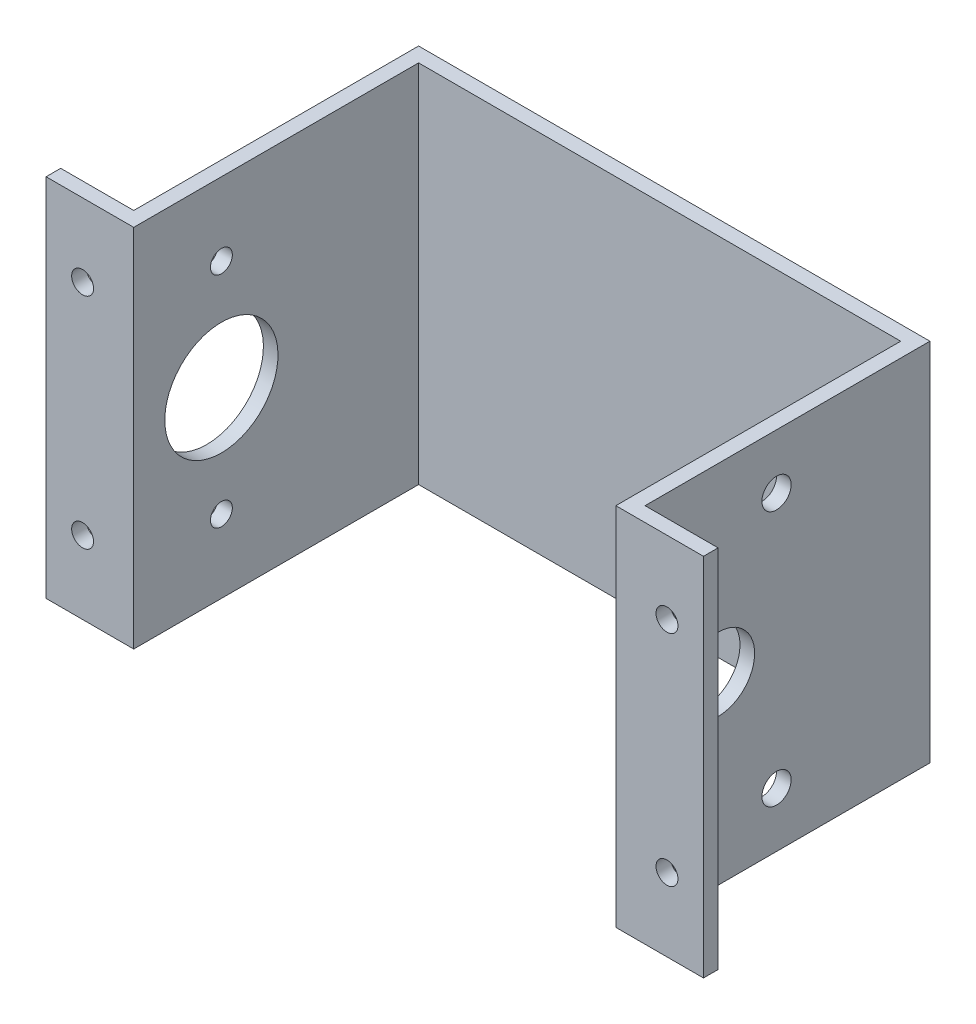
ISO-10303-21;
HEADER;
FILE_DESCRIPTION(('STEP AP214'),'2;1');
FILE_NAME('part.step','',(''),(''),'','','');
FILE_SCHEMA(('AUTOMOTIVE_DESIGN { 1 0 10303 214 1 1 1 1 }'));
ENDSEC;
DATA;
#1=APPLICATION_CONTEXT('core data for automotive mechanical design processes');
#2=APPLICATION_PROTOCOL_DEFINITION('international standard','automotive_design',2000,#1);
#3=PRODUCT_CONTEXT('',#1,'mechanical');
#4=PRODUCT('Part','Part','',(#3));
#5=PRODUCT_RELATED_PRODUCT_CATEGORY('part','',(#4));
#6=PRODUCT_DEFINITION_FORMATION('','',#4);
#7=PRODUCT_DEFINITION_CONTEXT('part definition',#1,'design');
#8=PRODUCT_DEFINITION('design','',#6,#7);
#9=PRODUCT_DEFINITION_SHAPE('','',#8);
#10=(LENGTH_UNIT() NAMED_UNIT(*) SI_UNIT(.MILLI.,.METRE.));
#11=(NAMED_UNIT(*) PLANE_ANGLE_UNIT() SI_UNIT($,.RADIAN.));
#12=(NAMED_UNIT(*) SI_UNIT($,.STERADIAN.) SOLID_ANGLE_UNIT());
#13=UNCERTAINTY_MEASURE_WITH_UNIT(LENGTH_MEASURE(1.E-05),#10,'distance_accuracy_value','');
#14=(GEOMETRIC_REPRESENTATION_CONTEXT(3) GLOBAL_UNCERTAINTY_ASSIGNED_CONTEXT((#13)) GLOBAL_UNIT_ASSIGNED_CONTEXT((#10,
#11,#12)) REPRESENTATION_CONTEXT('',''));
#15=CARTESIAN_POINT('',(0.,0.,0.));
#16=DIRECTION('',(0.,0.,1.));
#17=DIRECTION('',(1.,0.,0.));
#18=AXIS2_PLACEMENT_3D('',#15,#16,#17);
#19=CARTESIAN_POINT('',(0.,0.,2.));
#20=DIRECTION('',(0.,0.,-1.));
#21=DIRECTION('',(-1.,0.,0.));
#22=AXIS2_PLACEMENT_3D('',#19,#20,#21);
#23=PLANE('',#22);
#24=DIRECTION('',(0.,-1.,0.));
#25=VECTOR('',#24,1.);
#26=CARTESIAN_POINT('',(33.,25.,2.));
#27=LINE('',#26,#25);
#28=CARTESIAN_POINT('',(33.,25.,2.));
#29=VERTEX_POINT('',#28);
#30=CARTESIAN_POINT('',(33.,-25.,2.));
#31=VERTEX_POINT('',#30);
#32=EDGE_CURVE('E54',#29,#31,#27,.T.);
#33=ORIENTED_EDGE('',*,*,#32,.F.);
#34=DIRECTION('',(-1.,0.,0.));
#35=VECTOR('',#34,1.);
#36=CARTESIAN_POINT('',(35.,25.,2.));
#37=LINE('',#36,#35);
#38=CARTESIAN_POINT('',(-33.,25.,2.));
#39=VERTEX_POINT('',#38);
#40=EDGE_CURVE('E209',#29,#39,#37,.T.);
#41=ORIENTED_EDGE('',*,*,#40,.T.);
#42=DIRECTION('',(0.,1.,0.));
#43=VECTOR('',#42,1.);
#44=CARTESIAN_POINT('',(-33.,25.,2.));
#45=LINE('',#44,#43);
#46=CARTESIAN_POINT('',(-33.,-25.,2.));
#47=VERTEX_POINT('',#46);
#48=EDGE_CURVE('E59',#47,#39,#45,.T.);
#49=ORIENTED_EDGE('',*,*,#48,.F.);
#50=DIRECTION('',(1.,0.,0.));
#51=VECTOR('',#50,1.);
#52=CARTESIAN_POINT('',(35.,-25.,2.));
#53=LINE('',#52,#51);
#54=EDGE_CURVE('E207',#47,#31,#53,.T.);
#55=ORIENTED_EDGE('',*,*,#54,.T.);
#56=EDGE_LOOP('',(#33,#41,#49,#55));
#57=FACE_BOUND('',#56,.T.);
#58=ADVANCED_FACE('F39',(#57),#23,.F.);
#59=CARTESIAN_POINT('',(-35.,25.,2.));
#60=DIRECTION('',(1.,0.,0.));
#61=DIRECTION('',(0.,1.,0.));
#62=AXIS2_PLACEMENT_3D('',#59,#60,#61);
#63=PLANE('',#62);
#64=CARTESIAN_POINT('',(-35.,-15.,29.));
#65=DIRECTION('',(-1.,0.,0.));
#66=DIRECTION('',(0.,-1.,0.));
#67=AXIS2_PLACEMENT_3D('',#64,#65,#66);
#68=CIRCLE('',#67,1.5);
#69=CARTESIAN_POINT('',(-35.,-16.5,29.));
#70=VERTEX_POINT('',#69);
#71=EDGE_CURVE('E548',#70,#70,#68,.T.);
#72=ORIENTED_EDGE('',*,*,#71,.F.);
#73=EDGE_LOOP('',(#72));
#74=FACE_BOUND('',#73,.T.);
#75=CARTESIAN_POINT('',(-35.,15.,29.));
#76=DIRECTION('',(-1.,0.,0.));
#77=DIRECTION('',(0.,-1.,0.));
#78=AXIS2_PLACEMENT_3D('',#75,#76,#77);
#79=CIRCLE('',#78,1.5);
#80=CARTESIAN_POINT('',(-35.,13.5,29.));
#81=VERTEX_POINT('',#80);
#82=EDGE_CURVE('E541',#81,#81,#79,.T.);
#83=ORIENTED_EDGE('',*,*,#82,.F.);
#84=EDGE_LOOP('',(#83));
#85=FACE_BOUND('',#84,.T.);
#86=CARTESIAN_POINT('',(-35.,0.,29.));
#87=DIRECTION('',(-1.,0.,0.));
#88=DIRECTION('',(0.,-1.,0.));
#89=AXIS2_PLACEMENT_3D('',#86,#87,#88);
#90=CIRCLE('',#89,7.74999999999999);
#91=CARTESIAN_POINT('',(-35.,-7.75,29.));
#92=VERTEX_POINT('',#91);
#93=EDGE_CURVE('E544',#92,#92,#90,.T.);
#94=ORIENTED_EDGE('',*,*,#93,.F.);
#95=EDGE_LOOP('',(#94));
#96=FACE_BOUND('',#95,.T.);
#97=DIRECTION('',(0.,-1.,0.));
#98=VECTOR('',#97,1.);
#99=CARTESIAN_POINT('',(-35.,25.,0.));
#100=LINE('',#99,#98);
#101=CARTESIAN_POINT('',(-35.,25.,0.));
#102=VERTEX_POINT('',#101);
#103=CARTESIAN_POINT('',(-35.,-25.,0.));
#104=VERTEX_POINT('',#103);
#105=EDGE_CURVE('E197',#102,#104,#100,.T.);
#106=ORIENTED_EDGE('',*,*,#105,.T.);
#107=DIRECTION('',(0.,0.,-1.));
#108=VECTOR('',#107,1.);
#109=CARTESIAN_POINT('',(-35.,-25.,2.));
#110=LINE('',#109,#108);
#111=CARTESIAN_POINT('',(-35.,-25.,39.));
#112=VERTEX_POINT('',#111);
#113=EDGE_CURVE('E11',#112,#104,#110,.T.);
#114=ORIENTED_EDGE('',*,*,#113,.F.);
#115=DIRECTION('',(0.,-1.,0.));
#116=VECTOR('',#115,1.);
#117=CARTESIAN_POINT('',(-35.,25.,39.));
#118=LINE('',#117,#116);
#119=CARTESIAN_POINT('',(-35.,25.,39.));
#120=VERTEX_POINT('',#119);
#121=EDGE_CURVE('E203',#120,#112,#118,.T.);
#122=ORIENTED_EDGE('',*,*,#121,.F.);
#123=DIRECTION('',(0.,0.,-1.));
#124=VECTOR('',#123,1.);
#125=CARTESIAN_POINT('',(-35.,25.,2.));
#126=LINE('',#125,#124);
#127=EDGE_CURVE('E212',#120,#102,#126,.T.);
#128=ORIENTED_EDGE('',*,*,#127,.T.);
#129=EDGE_LOOP('',(#106,#114,#122,#128));
#130=FACE_BOUND('',#129,.T.);
#131=ADVANCED_FACE('F41',(#74,#85,#96,#130),#63,.F.);
#132=CARTESIAN_POINT('',(35.,-25.,2.));
#133=DIRECTION('',(0.,1.,0.));
#134=DIRECTION('',(-1.,0.,0.));
#135=AXIS2_PLACEMENT_3D('',#132,#133,#134);
#136=PLANE('',#135);
#137=DIRECTION('',(1.,0.,0.));
#138=VECTOR('',#137,1.);
#139=CARTESIAN_POINT('',(35.,-25.,0.));
#140=LINE('',#139,#138);
#141=CARTESIAN_POINT('',(35.,-25.,0.));
#142=VERTEX_POINT('',#141);
#143=EDGE_CURVE('E215',#104,#142,#140,.T.);
#144=ORIENTED_EDGE('',*,*,#143,.T.);
#145=DIRECTION('',(0.,0.,-1.));
#146=VECTOR('',#145,1.);
#147=CARTESIAN_POINT('',(35.,-25.,2.));
#148=LINE('',#147,#146);
#149=CARTESIAN_POINT('',(35.,-25.,39.));
#150=VERTEX_POINT('',#149);
#151=EDGE_CURVE('E47',#150,#142,#148,.T.);
#152=ORIENTED_EDGE('',*,*,#151,.F.);
#153=DIRECTION('',(1.,0.,0.));
#154=VECTOR('',#153,1.);
#155=CARTESIAN_POINT('',(33.,-25.,39.));
#156=LINE('',#155,#154);
#157=CARTESIAN_POINT('',(45.,-25.,39.));
#158=VERTEX_POINT('',#157);
#159=EDGE_CURVE('E162',#150,#158,#156,.T.);
#160=ORIENTED_EDGE('',*,*,#159,.T.);
#161=DIRECTION('',(0.,0.,-1.));
#162=VECTOR('',#161,1.);
#163=CARTESIAN_POINT('',(45.,-25.,41.));
#164=LINE('',#163,#162);
#165=CARTESIAN_POINT('',(45.,-25.,41.));
#166=VERTEX_POINT('',#165);
#167=EDGE_CURVE('E141',#166,#158,#164,.T.);
#168=ORIENTED_EDGE('',*,*,#167,.F.);
#169=DIRECTION('',(1.,0.,0.));
#170=VECTOR('',#169,1.);
#171=CARTESIAN_POINT('',(33.,-25.,41.));
#172=LINE('',#171,#170);
#173=CARTESIAN_POINT('',(33.,-25.,41.));
#174=VERTEX_POINT('',#173);
#175=EDGE_CURVE('E138',#174,#166,#172,.T.);
#176=ORIENTED_EDGE('',*,*,#175,.F.);
#177=DIRECTION('',(0.,0.,-1.));
#178=VECTOR('',#177,1.);
#179=CARTESIAN_POINT('',(33.,-25.,39.));
#180=LINE('',#179,#178);
#181=EDGE_CURVE('E127',#174,#31,#180,.T.);
#182=ORIENTED_EDGE('',*,*,#181,.T.);
#183=ORIENTED_EDGE('',*,*,#54,.F.);
#184=DIRECTION('',(0.,0.,-1.));
#185=VECTOR('',#184,1.);
#186=CARTESIAN_POINT('',(-33.,-25.,39.));
#187=LINE('',#186,#185);
#188=CARTESIAN_POINT('',(-33.,-25.,41.));
#189=VERTEX_POINT('',#188);
#190=EDGE_CURVE('E169',#189,#47,#187,.T.);
#191=ORIENTED_EDGE('',*,*,#190,.F.);
#192=DIRECTION('',(1.,0.,0.));
#193=VECTOR('',#192,1.);
#194=CARTESIAN_POINT('',(-33.,-25.,41.));
#195=LINE('',#194,#193);
#196=CARTESIAN_POINT('',(-45.,-25.,41.));
#197=VERTEX_POINT('',#196);
#198=EDGE_CURVE('E177',#197,#189,#195,.T.);
#199=ORIENTED_EDGE('',*,*,#198,.F.);
#200=DIRECTION('',(0.,0.,-1.));
#201=VECTOR('',#200,1.);
#202=CARTESIAN_POINT('',(-45.,-25.,41.));
#203=LINE('',#202,#201);
#204=CARTESIAN_POINT('',(-45.,-25.,39.));
#205=VERTEX_POINT('',#204);
#206=EDGE_CURVE('E173',#197,#205,#203,.T.);
#207=ORIENTED_EDGE('',*,*,#206,.T.);
#208=DIRECTION('',(1.,0.,0.));
#209=VECTOR('',#208,1.);
#210=CARTESIAN_POINT('',(-33.,-25.,39.));
#211=LINE('',#210,#209);
#212=EDGE_CURVE('E178',#205,#112,#211,.T.);
#213=ORIENTED_EDGE('',*,*,#212,.T.);
#214=ORIENTED_EDGE('',*,*,#113,.T.);
#215=EDGE_LOOP('',(#144,#152,#160,#168,#176,#182,#183,#191,#199,#207,#213,#214));
#216=FACE_BOUND('',#215,.T.);
#217=ADVANCED_FACE('F139',(#216),#136,.F.);
#218=CARTESIAN_POINT('',(35.,25.,2.));
#219=DIRECTION('',(-1.,0.,0.));
#220=DIRECTION('',(0.,-1.,0.));
#221=AXIS2_PLACEMENT_3D('',#218,#219,#220);
#222=PLANE('',#221);
#223=CARTESIAN_POINT('',(35.,0.,29.));
#224=DIRECTION('',(1.,0.,0.));
#225=DIRECTION('',(0.,1.,0.));
#226=AXIS2_PLACEMENT_3D('',#223,#224,#225);
#227=CIRCLE('',#226,5.);
#228=CARTESIAN_POINT('',(35.,5.,29.));
#229=VERTEX_POINT('',#228);
#230=EDGE_CURVE('E560',#229,#229,#227,.T.);
#231=ORIENTED_EDGE('',*,*,#230,.F.);
#232=EDGE_LOOP('',(#231));
#233=FACE_BOUND('',#232,.T.);
#234=CARTESIAN_POINT('',(35.,17.5,21.));
#235=DIRECTION('',(1.,0.,0.));
#236=DIRECTION('',(0.,1.,0.));
#237=AXIS2_PLACEMENT_3D('',#234,#235,#236);
#238=CIRCLE('',#237,2.00000000000001);
#239=CARTESIAN_POINT('',(35.,19.5,21.));
#240=VERTEX_POINT('',#239);
#241=EDGE_CURVE('E563',#240,#240,#238,.T.);
#242=ORIENTED_EDGE('',*,*,#241,.F.);
#243=EDGE_LOOP('',(#242));
#244=FACE_BOUND('',#243,.T.);
#245=CARTESIAN_POINT('',(35.,-17.5,21.));
#246=DIRECTION('',(1.,0.,0.));
#247=DIRECTION('',(0.,1.,0.));
#248=AXIS2_PLACEMENT_3D('',#245,#246,#247);
#249=CIRCLE('',#248,2.00000000000001);
#250=CARTESIAN_POINT('',(35.,-15.5,21.));
#251=VERTEX_POINT('',#250);
#252=EDGE_CURVE('E568',#251,#251,#249,.T.);
#253=ORIENTED_EDGE('',*,*,#252,.F.);
#254=EDGE_LOOP('',(#253));
#255=FACE_BOUND('',#254,.T.);
#256=DIRECTION('',(0.,1.,0.));
#257=VECTOR('',#256,1.);
#258=CARTESIAN_POINT('',(35.,25.,0.));
#259=LINE('',#258,#257);
#260=CARTESIAN_POINT('',(35.,25.,0.));
#261=VERTEX_POINT('',#260);
#262=EDGE_CURVE('E217',#142,#261,#259,.T.);
#263=ORIENTED_EDGE('',*,*,#262,.T.);
#264=DIRECTION('',(0.,0.,-1.));
#265=VECTOR('',#264,1.);
#266=CARTESIAN_POINT('',(35.,25.,2.));
#267=LINE('',#266,#265);
#268=CARTESIAN_POINT('',(35.,25.,39.));
#269=VERTEX_POINT('',#268);
#270=EDGE_CURVE('E222',#269,#261,#267,.T.);
#271=ORIENTED_EDGE('',*,*,#270,.F.);
#272=DIRECTION('',(0.,1.,0.));
#273=VECTOR('',#272,1.);
#274=CARTESIAN_POINT('',(35.,25.,39.));
#275=LINE('',#274,#273);
#276=EDGE_CURVE('E135',#150,#269,#275,.T.);
#277=ORIENTED_EDGE('',*,*,#276,.F.);
#278=ORIENTED_EDGE('',*,*,#151,.T.);
#279=EDGE_LOOP('',(#263,#271,#277,#278));
#280=FACE_BOUND('',#279,.T.);
#281=ADVANCED_FACE('F228',(#233,#244,#255,#280),#222,.F.);
#282=CARTESIAN_POINT('',(35.,25.,2.));
#283=DIRECTION('',(0.,-1.,0.));
#284=DIRECTION('',(1.,0.,0.));
#285=AXIS2_PLACEMENT_3D('',#282,#283,#284);
#286=PLANE('',#285);
#287=DIRECTION('',(-1.,0.,0.));
#288=VECTOR('',#287,1.);
#289=CARTESIAN_POINT('',(35.,25.,0.));
#290=LINE('',#289,#288);
#291=EDGE_CURVE('E210',#261,#102,#290,.T.);
#292=ORIENTED_EDGE('',*,*,#291,.T.);
#293=ORIENTED_EDGE('',*,*,#127,.F.);
#294=DIRECTION('',(-1.,0.,0.));
#295=VECTOR('',#294,1.);
#296=CARTESIAN_POINT('',(-33.,25.,39.));
#297=LINE('',#296,#295);
#298=CARTESIAN_POINT('',(-45.,25.,39.));
#299=VERTEX_POINT('',#298);
#300=EDGE_CURVE('E164',#120,#299,#297,.T.);
#301=ORIENTED_EDGE('',*,*,#300,.T.);
#302=DIRECTION('',(0.,0.,-1.));
#303=VECTOR('',#302,1.);
#304=CARTESIAN_POINT('',(-45.,25.,41.));
#305=LINE('',#304,#303);
#306=CARTESIAN_POINT('',(-45.,25.,41.));
#307=VERTEX_POINT('',#306);
#308=EDGE_CURVE('E170',#307,#299,#305,.T.);
#309=ORIENTED_EDGE('',*,*,#308,.F.);
#310=DIRECTION('',(-1.,0.,0.));
#311=VECTOR('',#310,1.);
#312=CARTESIAN_POINT('',(-33.,25.,41.));
#313=LINE('',#312,#311);
#314=CARTESIAN_POINT('',(-33.,25.,41.));
#315=VERTEX_POINT('',#314);
#316=EDGE_CURVE('E189',#315,#307,#313,.T.);
#317=ORIENTED_EDGE('',*,*,#316,.F.);
#318=DIRECTION('',(0.,0.,-1.));
#319=VECTOR('',#318,1.);
#320=CARTESIAN_POINT('',(-33.,25.,39.));
#321=LINE('',#320,#319);
#322=EDGE_CURVE('E200',#315,#39,#321,.T.);
#323=ORIENTED_EDGE('',*,*,#322,.T.);
#324=ORIENTED_EDGE('',*,*,#40,.F.);
#325=DIRECTION('',(0.,0.,-1.));
#326=VECTOR('',#325,1.);
#327=CARTESIAN_POINT('',(33.,25.,39.));
#328=LINE('',#327,#326);
#329=CARTESIAN_POINT('',(33.,25.,41.));
#330=VERTEX_POINT('',#329);
#331=EDGE_CURVE('E134',#330,#29,#328,.T.);
#332=ORIENTED_EDGE('',*,*,#331,.F.);
#333=DIRECTION('',(-1.,0.,0.));
#334=VECTOR('',#333,1.);
#335=CARTESIAN_POINT('',(33.,25.,41.));
#336=LINE('',#335,#334);
#337=CARTESIAN_POINT('',(45.,25.,41.));
#338=VERTEX_POINT('',#337);
#339=EDGE_CURVE('E149',#338,#330,#336,.T.);
#340=ORIENTED_EDGE('',*,*,#339,.F.);
#341=DIRECTION('',(0.,0.,-1.));
#342=VECTOR('',#341,1.);
#343=CARTESIAN_POINT('',(45.,25.,41.));
#344=LINE('',#343,#342);
#345=CARTESIAN_POINT('',(45.,25.,39.));
#346=VERTEX_POINT('',#345);
#347=EDGE_CURVE('E161',#338,#346,#344,.T.);
#348=ORIENTED_EDGE('',*,*,#347,.T.);
#349=DIRECTION('',(-1.,0.,0.));
#350=VECTOR('',#349,1.);
#351=CARTESIAN_POINT('',(33.,25.,39.));
#352=LINE('',#351,#350);
#353=EDGE_CURVE('E150',#346,#269,#352,.T.);
#354=ORIENTED_EDGE('',*,*,#353,.T.);
#355=ORIENTED_EDGE('',*,*,#270,.T.);
#356=EDGE_LOOP('',(#292,#293,#301,#309,#317,#323,#324,#332,#340,#348,#354,#355));
#357=FACE_BOUND('',#356,.T.);
#358=ADVANCED_FACE('F235',(#357),#286,.F.);
#359=CARTESIAN_POINT('',(0.,0.,0.));
#360=DIRECTION('',(0.,0.,-1.));
#361=DIRECTION('',(-1.,0.,0.));
#362=AXIS2_PLACEMENT_3D('',#359,#360,#361);
#363=PLANE('',#362);
#364=ORIENTED_EDGE('',*,*,#105,.F.);
#365=ORIENTED_EDGE('',*,*,#291,.F.);
#366=ORIENTED_EDGE('',*,*,#262,.F.);
#367=ORIENTED_EDGE('',*,*,#143,.F.);
#368=EDGE_LOOP('',(#364,#365,#366,#367));
#369=FACE_BOUND('',#368,.T.);
#370=ADVANCED_FACE('F233',(#369),#363,.T.);
#371=CARTESIAN_POINT('',(-33.,25.,39.));
#372=DIRECTION('',(-1.,0.,0.));
#373=DIRECTION('',(0.,-1.,0.));
#374=AXIS2_PLACEMENT_3D('',#371,#372,#373);
#375=PLANE('',#374);
#376=CARTESIAN_POINT('',(-33.,-15.,29.));
#377=DIRECTION('',(-1.,0.,0.));
#378=DIRECTION('',(0.,-1.,0.));
#379=AXIS2_PLACEMENT_3D('',#376,#377,#378);
#380=CIRCLE('',#379,1.5);
#381=CARTESIAN_POINT('',(-33.,-16.5,29.));
#382=VERTEX_POINT('',#381);
#383=EDGE_CURVE('E539',#382,#382,#380,.T.);
#384=ORIENTED_EDGE('',*,*,#383,.T.);
#385=EDGE_LOOP('',(#384));
#386=FACE_BOUND('',#385,.T.);
#387=CARTESIAN_POINT('',(-33.,15.,29.));
#388=DIRECTION('',(-1.,0.,0.));
#389=DIRECTION('',(0.,-1.,0.));
#390=AXIS2_PLACEMENT_3D('',#387,#388,#389);
#391=CIRCLE('',#390,1.5);
#392=CARTESIAN_POINT('',(-33.,13.5,29.));
#393=VERTEX_POINT('',#392);
#394=EDGE_CURVE('E545',#393,#393,#391,.T.);
#395=ORIENTED_EDGE('',*,*,#394,.T.);
#396=EDGE_LOOP('',(#395));
#397=FACE_BOUND('',#396,.T.);
#398=CARTESIAN_POINT('',(-33.,0.,29.));
#399=DIRECTION('',(-1.,0.,0.));
#400=DIRECTION('',(0.,-1.,0.));
#401=AXIS2_PLACEMENT_3D('',#398,#399,#400);
#402=CIRCLE('',#401,7.74999999999999);
#403=CARTESIAN_POINT('',(-33.,-7.75,29.));
#404=VERTEX_POINT('',#403);
#405=EDGE_CURVE('E553',#404,#404,#402,.T.);
#406=ORIENTED_EDGE('',*,*,#405,.T.);
#407=EDGE_LOOP('',(#406));
#408=FACE_BOUND('',#407,.T.);
#409=ORIENTED_EDGE('',*,*,#48,.T.);
#410=ORIENTED_EDGE('',*,*,#322,.F.);
#411=DIRECTION('',(0.,1.,0.));
#412=VECTOR('',#411,1.);
#413=CARTESIAN_POINT('',(-33.,25.,41.));
#414=LINE('',#413,#412);
#415=EDGE_CURVE('E182',#189,#315,#414,.T.);
#416=ORIENTED_EDGE('',*,*,#415,.F.);
#417=ORIENTED_EDGE('',*,*,#190,.T.);
#418=EDGE_LOOP('',(#409,#410,#416,#417));
#419=FACE_BOUND('',#418,.T.);
#420=ADVANCED_FACE('F254',(#386,#397,#408,#419),#375,.F.);
#421=CARTESIAN_POINT('',(33.,25.,39.));
#422=DIRECTION('',(1.,0.,0.));
#423=DIRECTION('',(0.,1.,0.));
#424=AXIS2_PLACEMENT_3D('',#421,#422,#423);
#425=PLANE('',#424);
#426=CARTESIAN_POINT('',(33.,0.,29.));
#427=DIRECTION('',(1.,0.,0.));
#428=DIRECTION('',(0.,1.,0.));
#429=AXIS2_PLACEMENT_3D('',#426,#427,#428);
#430=CIRCLE('',#429,5.);
#431=CARTESIAN_POINT('',(33.,5.,29.));
#432=VERTEX_POINT('',#431);
#433=EDGE_CURVE('E174',#432,#432,#430,.T.);
#434=ORIENTED_EDGE('',*,*,#433,.T.);
#435=EDGE_LOOP('',(#434));
#436=FACE_BOUND('',#435,.T.);
#437=CARTESIAN_POINT('',(33.,17.5,21.));
#438=DIRECTION('',(1.,0.,0.));
#439=DIRECTION('',(0.,1.,0.));
#440=AXIS2_PLACEMENT_3D('',#437,#438,#439);
#441=CIRCLE('',#440,2.00000000000001);
#442=CARTESIAN_POINT('',(33.,19.5,21.));
#443=VERTEX_POINT('',#442);
#444=EDGE_CURVE('E566',#443,#443,#441,.T.);
#445=ORIENTED_EDGE('',*,*,#444,.T.);
#446=EDGE_LOOP('',(#445));
#447=FACE_BOUND('',#446,.T.);
#448=CARTESIAN_POINT('',(33.,-17.5,21.));
#449=DIRECTION('',(1.,0.,0.));
#450=DIRECTION('',(0.,1.,0.));
#451=AXIS2_PLACEMENT_3D('',#448,#449,#450);
#452=CIRCLE('',#451,2.00000000000001);
#453=CARTESIAN_POINT('',(33.,-15.5,21.));
#454=VERTEX_POINT('',#453);
#455=EDGE_CURVE('E156',#454,#454,#452,.T.);
#456=ORIENTED_EDGE('',*,*,#455,.T.);
#457=EDGE_LOOP('',(#456));
#458=FACE_BOUND('',#457,.T.);
#459=ORIENTED_EDGE('',*,*,#32,.T.);
#460=ORIENTED_EDGE('',*,*,#181,.F.);
#461=DIRECTION('',(0.,-1.,0.));
#462=VECTOR('',#461,1.);
#463=CARTESIAN_POINT('',(33.,25.,41.));
#464=LINE('',#463,#462);
#465=EDGE_CURVE('E132',#330,#174,#464,.T.);
#466=ORIENTED_EDGE('',*,*,#465,.F.);
#467=ORIENTED_EDGE('',*,*,#331,.T.);
#468=EDGE_LOOP('',(#459,#460,#466,#467));
#469=FACE_BOUND('',#468,.T.);
#470=ADVANCED_FACE('F129',(#436,#447,#458,#469),#425,.F.);
#471=CARTESIAN_POINT('',(0.,0.,39.));
#472=DIRECTION('',(0.,0.,1.));
#473=DIRECTION('',(1.,0.,0.));
#474=AXIS2_PLACEMENT_3D('',#471,#472,#473);
#475=PLANE('',#474);
#476=CARTESIAN_POINT('',(40.,-15.,39.));
#477=DIRECTION('',(0.,0.,-1.));
#478=DIRECTION('',(1.,0.,0.));
#479=AXIS2_PLACEMENT_3D('',#476,#477,#478);
#480=CIRCLE('',#479,1.5);
#481=CARTESIAN_POINT('',(41.5,-15.,39.));
#482=VERTEX_POINT('',#481);
#483=EDGE_CURVE('E518',#482,#482,#480,.T.);
#484=ORIENTED_EDGE('',*,*,#483,.F.);
#485=EDGE_LOOP('',(#484));
#486=FACE_BOUND('',#485,.T.);
#487=CARTESIAN_POINT('',(40.,15.,39.));
#488=DIRECTION('',(0.,0.,-1.));
#489=DIRECTION('',(-1.,0.,0.));
#490=AXIS2_PLACEMENT_3D('',#487,#488,#489);
#491=CIRCLE('',#490,1.5);
#492=CARTESIAN_POINT('',(38.5,15.,39.));
#493=VERTEX_POINT('',#492);
#494=EDGE_CURVE('E519',#493,#493,#491,.T.);
#495=ORIENTED_EDGE('',*,*,#494,.F.);
#496=EDGE_LOOP('',(#495));
#497=FACE_BOUND('',#496,.T.);
#498=ORIENTED_EDGE('',*,*,#159,.F.);
#499=ORIENTED_EDGE('',*,*,#276,.T.);
#500=ORIENTED_EDGE('',*,*,#353,.F.);
#501=DIRECTION('',(0.,1.,0.));
#502=VECTOR('',#501,1.);
#503=CARTESIAN_POINT('',(45.,25.,39.));
#504=LINE('',#503,#502);
#505=EDGE_CURVE('E153',#158,#346,#504,.T.);
#506=ORIENTED_EDGE('',*,*,#505,.F.);
#507=EDGE_LOOP('',(#498,#499,#500,#506));
#508=FACE_BOUND('',#507,.T.);
#509=ADVANCED_FACE('F287',(#486,#497,#508),#475,.F.);
#510=CARTESIAN_POINT('',(45.,25.,41.));
#511=DIRECTION('',(-1.,0.,0.));
#512=DIRECTION('',(0.,-1.,0.));
#513=AXIS2_PLACEMENT_3D('',#510,#511,#512);
#514=PLANE('',#513);
#515=ORIENTED_EDGE('',*,*,#505,.T.);
#516=ORIENTED_EDGE('',*,*,#347,.F.);
#517=DIRECTION('',(0.,1.,0.));
#518=VECTOR('',#517,1.);
#519=CARTESIAN_POINT('',(45.,25.,41.));
#520=LINE('',#519,#518);
#521=EDGE_CURVE('E144',#166,#338,#520,.T.);
#522=ORIENTED_EDGE('',*,*,#521,.F.);
#523=ORIENTED_EDGE('',*,*,#167,.T.);
#524=EDGE_LOOP('',(#515,#516,#522,#523));
#525=FACE_BOUND('',#524,.T.);
#526=ADVANCED_FACE('F283',(#525),#514,.F.);
#527=CARTESIAN_POINT('',(0.,0.,41.));
#528=DIRECTION('',(0.,0.,1.));
#529=DIRECTION('',(1.,0.,0.));
#530=AXIS2_PLACEMENT_3D('',#527,#528,#529);
#531=PLANE('',#530);
#532=CARTESIAN_POINT('',(40.,-15.,41.));
#533=DIRECTION('',(0.,0.,-1.));
#534=DIRECTION('',(1.,0.,0.));
#535=AXIS2_PLACEMENT_3D('',#532,#533,#534);
#536=CIRCLE('',#535,1.5);
#537=CARTESIAN_POINT('',(41.5,-15.,41.));
#538=VERTEX_POINT('',#537);
#539=EDGE_CURVE('E515',#538,#538,#536,.T.);
#540=ORIENTED_EDGE('',*,*,#539,.T.);
#541=EDGE_LOOP('',(#540));
#542=FACE_BOUND('',#541,.T.);
#543=CARTESIAN_POINT('',(40.,15.,41.));
#544=DIRECTION('',(0.,0.,-1.));
#545=DIRECTION('',(-1.,0.,0.));
#546=AXIS2_PLACEMENT_3D('',#543,#544,#545);
#547=CIRCLE('',#546,1.5);
#548=CARTESIAN_POINT('',(38.5,15.,41.));
#549=VERTEX_POINT('',#548);
#550=EDGE_CURVE('E522',#549,#549,#547,.T.);
#551=ORIENTED_EDGE('',*,*,#550,.T.);
#552=EDGE_LOOP('',(#551));
#553=FACE_BOUND('',#552,.T.);
#554=ORIENTED_EDGE('',*,*,#465,.T.);
#555=ORIENTED_EDGE('',*,*,#175,.T.);
#556=ORIENTED_EDGE('',*,*,#521,.T.);
#557=ORIENTED_EDGE('',*,*,#339,.T.);
#558=EDGE_LOOP('',(#554,#555,#556,#557));
#559=FACE_BOUND('',#558,.T.);
#560=ADVANCED_FACE('F147',(#542,#553,#559),#531,.T.);
#561=CARTESIAN_POINT('',(0.,0.,39.));
#562=DIRECTION('',(0.,0.,-1.));
#563=DIRECTION('',(-1.,0.,0.));
#564=AXIS2_PLACEMENT_3D('',#561,#562,#563);
#565=PLANE('',#564);
#566=CARTESIAN_POINT('',(-40.,15.,39.));
#567=DIRECTION('',(0.,0.,-1.));
#568=DIRECTION('',(1.,0.,0.));
#569=AXIS2_PLACEMENT_3D('',#566,#567,#568);
#570=CIRCLE('',#569,1.5);
#571=CARTESIAN_POINT('',(-38.5,15.,39.));
#572=VERTEX_POINT('',#571);
#573=EDGE_CURVE('E532',#572,#572,#570,.T.);
#574=ORIENTED_EDGE('',*,*,#573,.F.);
#575=EDGE_LOOP('',(#574));
#576=FACE_BOUND('',#575,.T.);
#577=CARTESIAN_POINT('',(-40.,-15.,39.));
#578=DIRECTION('',(0.,0.,-1.));
#579=DIRECTION('',(-1.,0.,0.));
#580=AXIS2_PLACEMENT_3D('',#577,#578,#579);
#581=CIRCLE('',#580,1.5);
#582=CARTESIAN_POINT('',(-41.5,-15.,39.));
#583=VERTEX_POINT('',#582);
#584=EDGE_CURVE('E524',#583,#583,#581,.T.);
#585=ORIENTED_EDGE('',*,*,#584,.F.);
#586=EDGE_LOOP('',(#585));
#587=FACE_BOUND('',#586,.T.);
#588=ORIENTED_EDGE('',*,*,#121,.T.);
#589=ORIENTED_EDGE('',*,*,#212,.F.);
#590=DIRECTION('',(0.,-1.,0.));
#591=VECTOR('',#590,1.);
#592=CARTESIAN_POINT('',(-45.,25.,39.));
#593=LINE('',#592,#591);
#594=EDGE_CURVE('E181',#299,#205,#593,.T.);
#595=ORIENTED_EDGE('',*,*,#594,.F.);
#596=ORIENTED_EDGE('',*,*,#300,.F.);
#597=EDGE_LOOP('',(#588,#589,#595,#596));
#598=FACE_BOUND('',#597,.T.);
#599=ADVANCED_FACE('F242',(#576,#587,#598),#565,.T.);
#600=CARTESIAN_POINT('',(-45.,25.,41.));
#601=DIRECTION('',(1.,0.,0.));
#602=DIRECTION('',(0.,1.,0.));
#603=AXIS2_PLACEMENT_3D('',#600,#601,#602);
#604=PLANE('',#603);
#605=ORIENTED_EDGE('',*,*,#594,.T.);
#606=ORIENTED_EDGE('',*,*,#206,.F.);
#607=DIRECTION('',(0.,-1.,0.));
#608=VECTOR('',#607,1.);
#609=CARTESIAN_POINT('',(-45.,25.,41.));
#610=LINE('',#609,#608);
#611=EDGE_CURVE('E187',#307,#197,#610,.T.);
#612=ORIENTED_EDGE('',*,*,#611,.F.);
#613=ORIENTED_EDGE('',*,*,#308,.T.);
#614=EDGE_LOOP('',(#605,#606,#612,#613));
#615=FACE_BOUND('',#614,.T.);
#616=ADVANCED_FACE('F247',(#615),#604,.F.);
#617=CARTESIAN_POINT('',(0.,0.,41.));
#618=DIRECTION('',(0.,0.,-1.));
#619=DIRECTION('',(-1.,0.,0.));
#620=AXIS2_PLACEMENT_3D('',#617,#618,#619);
#621=PLANE('',#620);
#622=CARTESIAN_POINT('',(-40.,15.,41.));
#623=DIRECTION('',(0.,0.,-1.));
#624=DIRECTION('',(1.,0.,0.));
#625=AXIS2_PLACEMENT_3D('',#622,#623,#624);
#626=CIRCLE('',#625,1.5);
#627=CARTESIAN_POINT('',(-38.5,15.,41.));
#628=VERTEX_POINT('',#627);
#629=EDGE_CURVE('E535',#628,#628,#626,.T.);
#630=ORIENTED_EDGE('',*,*,#629,.T.);
#631=EDGE_LOOP('',(#630));
#632=FACE_BOUND('',#631,.T.);
#633=CARTESIAN_POINT('',(-40.,-15.,41.));
#634=DIRECTION('',(0.,0.,-1.));
#635=DIRECTION('',(-1.,0.,0.));
#636=AXIS2_PLACEMENT_3D('',#633,#634,#635);
#637=CIRCLE('',#636,1.5);
#638=CARTESIAN_POINT('',(-41.5,-15.,41.));
#639=VERTEX_POINT('',#638);
#640=EDGE_CURVE('E529',#639,#639,#637,.T.);
#641=ORIENTED_EDGE('',*,*,#640,.T.);
#642=EDGE_LOOP('',(#641));
#643=FACE_BOUND('',#642,.T.);
#644=ORIENTED_EDGE('',*,*,#415,.T.);
#645=ORIENTED_EDGE('',*,*,#316,.T.);
#646=ORIENTED_EDGE('',*,*,#611,.T.);
#647=ORIENTED_EDGE('',*,*,#198,.T.);
#648=EDGE_LOOP('',(#644,#645,#646,#647));
#649=FACE_BOUND('',#648,.T.);
#650=ADVANCED_FACE('F251',(#632,#643,#649),#621,.F.);
#651=CARTESIAN_POINT('',(33.,-17.5,21.));
#652=DIRECTION('',(1.,0.,0.));
#653=DIRECTION('',(0.,1.,0.));
#654=AXIS2_PLACEMENT_3D('',#651,#652,#653);
#655=CYLINDRICAL_SURFACE('',#654,2.00000000000001);
#656=ORIENTED_EDGE('',*,*,#455,.F.);
#657=EDGE_LOOP('',(#656));
#658=FACE_BOUND('',#657,.T.);
#659=ORIENTED_EDGE('',*,*,#252,.T.);
#660=EDGE_LOOP('',(#659));
#661=FACE_BOUND('',#660,.T.);
#662=ADVANCED_FACE('F318',(#658,#661),#655,.F.);
#663=CARTESIAN_POINT('',(33.,17.5,21.));
#664=DIRECTION('',(1.,0.,0.));
#665=DIRECTION('',(0.,1.,0.));
#666=AXIS2_PLACEMENT_3D('',#663,#664,#665);
#667=CYLINDRICAL_SURFACE('',#666,2.00000000000001);
#668=ORIENTED_EDGE('',*,*,#444,.F.);
#669=EDGE_LOOP('',(#668));
#670=FACE_BOUND('',#669,.T.);
#671=ORIENTED_EDGE('',*,*,#241,.T.);
#672=EDGE_LOOP('',(#671));
#673=FACE_BOUND('',#672,.T.);
#674=ADVANCED_FACE('F322',(#670,#673),#667,.F.);
#675=CARTESIAN_POINT('',(33.,0.,29.));
#676=DIRECTION('',(1.,0.,0.));
#677=DIRECTION('',(0.,1.,0.));
#678=AXIS2_PLACEMENT_3D('',#675,#676,#677);
#679=CYLINDRICAL_SURFACE('',#678,5.);
#680=ORIENTED_EDGE('',*,*,#433,.F.);
#681=EDGE_LOOP('',(#680));
#682=FACE_BOUND('',#681,.T.);
#683=ORIENTED_EDGE('',*,*,#230,.T.);
#684=EDGE_LOOP('',(#683));
#685=FACE_BOUND('',#684,.T.);
#686=ADVANCED_FACE('F331',(#682,#685),#679,.F.);
#687=CARTESIAN_POINT('',(-33.,0.,29.));
#688=DIRECTION('',(-1.,0.,0.));
#689=DIRECTION('',(0.,-1.,0.));
#690=AXIS2_PLACEMENT_3D('',#687,#688,#689);
#691=CYLINDRICAL_SURFACE('',#690,7.74999999999999);
#692=ORIENTED_EDGE('',*,*,#405,.F.);
#693=EDGE_LOOP('',(#692));
#694=FACE_BOUND('',#693,.T.);
#695=ORIENTED_EDGE('',*,*,#93,.T.);
#696=EDGE_LOOP('',(#695));
#697=FACE_BOUND('',#696,.T.);
#698=ADVANCED_FACE('F339',(#694,#697),#691,.F.);
#699=CARTESIAN_POINT('',(-33.,15.,29.));
#700=DIRECTION('',(-1.,0.,0.));
#701=DIRECTION('',(0.,-1.,0.));
#702=AXIS2_PLACEMENT_3D('',#699,#700,#701);
#703=CYLINDRICAL_SURFACE('',#702,1.5);
#704=ORIENTED_EDGE('',*,*,#394,.F.);
#705=EDGE_LOOP('',(#704));
#706=FACE_BOUND('',#705,.T.);
#707=ORIENTED_EDGE('',*,*,#82,.T.);
#708=EDGE_LOOP('',(#707));
#709=FACE_BOUND('',#708,.T.);
#710=ADVANCED_FACE('F361',(#706,#709),#703,.F.);
#711=CARTESIAN_POINT('',(-33.,-15.,29.));
#712=DIRECTION('',(-1.,0.,0.));
#713=DIRECTION('',(0.,-1.,0.));
#714=AXIS2_PLACEMENT_3D('',#711,#712,#713);
#715=CYLINDRICAL_SURFACE('',#714,1.5);
#716=ORIENTED_EDGE('',*,*,#383,.F.);
#717=EDGE_LOOP('',(#716));
#718=FACE_BOUND('',#717,.T.);
#719=ORIENTED_EDGE('',*,*,#71,.T.);
#720=EDGE_LOOP('',(#719));
#721=FACE_BOUND('',#720,.T.);
#722=ADVANCED_FACE('F370',(#718,#721),#715,.F.);
#723=CARTESIAN_POINT('',(-40.,-15.,41.));
#724=DIRECTION('',(0.,0.,-1.));
#725=DIRECTION('',(-1.,0.,0.));
#726=AXIS2_PLACEMENT_3D('',#723,#724,#725);
#727=CYLINDRICAL_SURFACE('',#726,1.5);
#728=ORIENTED_EDGE('',*,*,#640,.F.);
#729=EDGE_LOOP('',(#728));
#730=FACE_BOUND('',#729,.T.);
#731=ORIENTED_EDGE('',*,*,#584,.T.);
#732=EDGE_LOOP('',(#731));
#733=FACE_BOUND('',#732,.T.);
#734=ADVANCED_FACE('F379',(#730,#733),#727,.F.);
#735=CARTESIAN_POINT('',(-40.,15.,41.));
#736=DIRECTION('',(0.,0.,-1.));
#737=DIRECTION('',(-1.,0.,0.));
#738=AXIS2_PLACEMENT_3D('',#735,#736,#737);
#739=CYLINDRICAL_SURFACE('',#738,1.5);
#740=ORIENTED_EDGE('',*,*,#629,.F.);
#741=EDGE_LOOP('',(#740));
#742=FACE_BOUND('',#741,.T.);
#743=ORIENTED_EDGE('',*,*,#573,.T.);
#744=EDGE_LOOP('',(#743));
#745=FACE_BOUND('',#744,.T.);
#746=ADVANCED_FACE('F416',(#742,#745),#739,.F.);
#747=CARTESIAN_POINT('',(40.,15.,41.));
#748=DIRECTION('',(0.,0.,-1.));
#749=DIRECTION('',(-1.,0.,0.));
#750=AXIS2_PLACEMENT_3D('',#747,#748,#749);
#751=CYLINDRICAL_SURFACE('',#750,1.5);
#752=ORIENTED_EDGE('',*,*,#550,.F.);
#753=EDGE_LOOP('',(#752));
#754=FACE_BOUND('',#753,.T.);
#755=ORIENTED_EDGE('',*,*,#494,.T.);
#756=EDGE_LOOP('',(#755));
#757=FACE_BOUND('',#756,.T.);
#758=ADVANCED_FACE('F425',(#754,#757),#751,.F.);
#759=CARTESIAN_POINT('',(40.,-15.,41.));
#760=DIRECTION('',(0.,0.,-1.));
#761=DIRECTION('',(-1.,0.,0.));
#762=AXIS2_PLACEMENT_3D('',#759,#760,#761);
#763=CYLINDRICAL_SURFACE('',#762,1.5);
#764=ORIENTED_EDGE('',*,*,#539,.F.);
#765=EDGE_LOOP('',(#764));
#766=FACE_BOUND('',#765,.T.);
#767=ORIENTED_EDGE('',*,*,#483,.T.);
#768=EDGE_LOOP('',(#767));
#769=FACE_BOUND('',#768,.T.);
#770=ADVANCED_FACE('F434',(#766,#769),#763,.F.);
#771=CLOSED_SHELL('',(#58,#131,#217,#281,#358,#370,#420,#470,#509,#526,#560,#599,#616,#650,#662,
#674,#686,#698,#710,#722,#734,#746,#758,#770));
#772=MANIFOLD_SOLID_BREP('B2',#771);
#773=ADVANCED_BREP_SHAPE_REPRESENTATION('',(#18,#772),#14);
#774=SHAPE_DEFINITION_REPRESENTATION(#9,#773);
ENDSEC;
END-ISO-10303-21;
